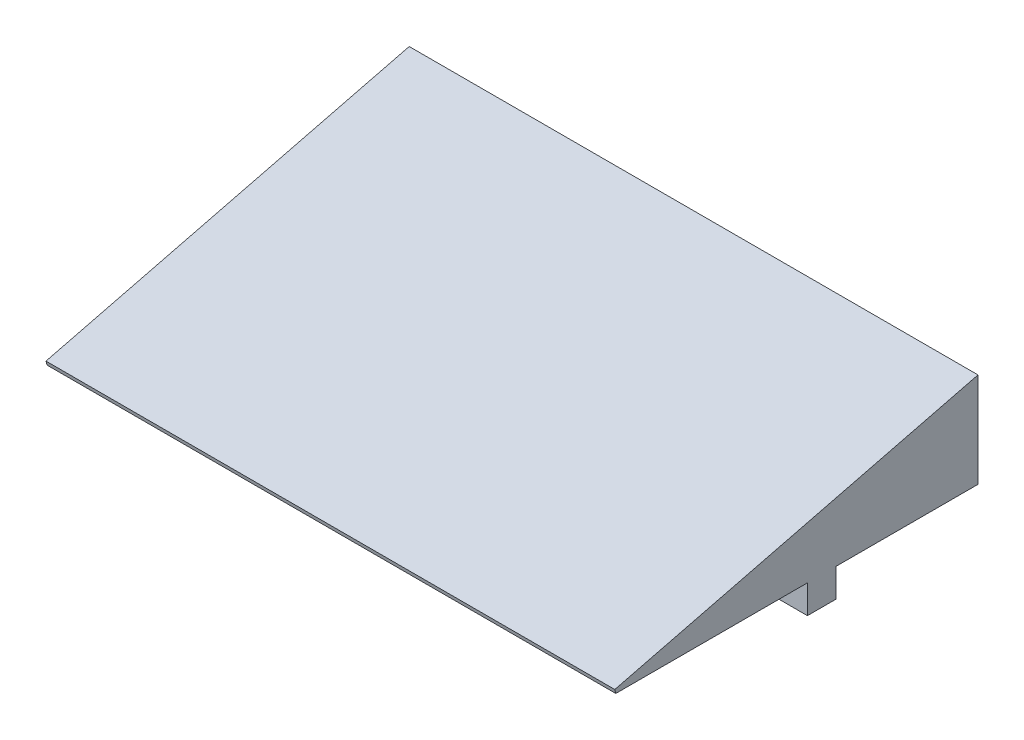
ISO-10303-21;
HEADER;
FILE_DESCRIPTION(('STEP AP214'),'2;1');
FILE_NAME('part.step','',(''),(''),'','','');
FILE_SCHEMA(('AUTOMOTIVE_DESIGN { 1 0 10303 214 1 1 1 1 }'));
ENDSEC;
DATA;
#1=APPLICATION_CONTEXT('core data for automotive mechanical design processes');
#2=APPLICATION_PROTOCOL_DEFINITION('international standard','automotive_design',2000,#1);
#3=PRODUCT_CONTEXT('',#1,'mechanical');
#4=PRODUCT('Part','Part','',(#3));
#5=PRODUCT_RELATED_PRODUCT_CATEGORY('part','',(#4));
#6=PRODUCT_DEFINITION_FORMATION('','',#4);
#7=PRODUCT_DEFINITION_CONTEXT('part definition',#1,'design');
#8=PRODUCT_DEFINITION('design','',#6,#7);
#9=PRODUCT_DEFINITION_SHAPE('','',#8);
#10=(LENGTH_UNIT() NAMED_UNIT(*) SI_UNIT(.MILLI.,.METRE.));
#11=(NAMED_UNIT(*) PLANE_ANGLE_UNIT() SI_UNIT($,.RADIAN.));
#12=(NAMED_UNIT(*) SI_UNIT($,.STERADIAN.) SOLID_ANGLE_UNIT());
#13=UNCERTAINTY_MEASURE_WITH_UNIT(LENGTH_MEASURE(1.E-05),#10,'distance_accuracy_value','');
#14=(GEOMETRIC_REPRESENTATION_CONTEXT(3) GLOBAL_UNCERTAINTY_ASSIGNED_CONTEXT((#13)) GLOBAL_UNIT_ASSIGNED_CONTEXT((#10,
#11,#12)) REPRESENTATION_CONTEXT('',''));
#15=CARTESIAN_POINT('',(0.,0.,0.));
#16=DIRECTION('',(0.,0.,1.));
#17=DIRECTION('',(1.,0.,0.));
#18=AXIS2_PLACEMENT_3D('',#15,#16,#17);
#19=CARTESIAN_POINT('',(0.,0.,0.));
#20=DIRECTION('',(0.,1.,0.));
#21=DIRECTION('',(0.,0.,1.));
#22=AXIS2_PLACEMENT_3D('',#19,#20,#21);
#23=PLANE('',#22);
#24=DIRECTION('',(1.,0.,0.));
#25=VECTOR('',#24,1.);
#26=CARTESIAN_POINT('',(-60.,0.,-10.0143227529929));
#27=LINE('',#26,#25);
#28=CARTESIAN_POINT('',(-60.,0.,-10.0143227529929));
#29=VERTEX_POINT('',#28);
#30=CARTESIAN_POINT('',(60.,0.,-10.0143227529929));
#31=VERTEX_POINT('',#30);
#32=EDGE_CURVE('E146',#29,#31,#27,.T.);
#33=ORIENTED_EDGE('',*,*,#32,.F.);
#34=DIRECTION('',(0.,0.,1.));
#35=VECTOR('',#34,1.);
#36=CARTESIAN_POINT('',(-60.,0.,-40.));
#37=LINE('',#36,#35);
#38=CARTESIAN_POINT('',(-60.,0.,-40.));
#39=VERTEX_POINT('',#38);
#40=EDGE_CURVE('E135',#39,#29,#37,.T.);
#41=ORIENTED_EDGE('',*,*,#40,.F.);
#42=DIRECTION('',(-1.,0.,0.));
#43=VECTOR('',#42,1.);
#44=CARTESIAN_POINT('',(-60.,0.,-40.));
#45=LINE('',#44,#43);
#46=CARTESIAN_POINT('',(60.,0.,-40.));
#47=VERTEX_POINT('',#46);
#48=EDGE_CURVE('E133',#47,#39,#45,.T.);
#49=ORIENTED_EDGE('',*,*,#48,.F.);
#50=DIRECTION('',(0.,0.,-1.));
#51=VECTOR('',#50,1.);
#52=CARTESIAN_POINT('',(60.,0.,-40.));
#53=LINE('',#52,#51);
#54=EDGE_CURVE('E125',#31,#47,#53,.T.);
#55=ORIENTED_EDGE('',*,*,#54,.F.);
#56=EDGE_LOOP('',(#33,#41,#49,#55));
#57=FACE_BOUND('',#56,.T.);
#58=ADVANCED_FACE('F35',(#57),#23,.F.);
#59=CARTESIAN_POINT('',(60.,20.,-40.));
#60=DIRECTION('',(-1.,0.,0.));
#61=DIRECTION('',(0.,0.,1.));
#62=AXIS2_PLACEMENT_3D('',#59,#60,#61);
#63=PLANE('',#62);
#64=DIRECTION('',(0.,-0.24261738767885,0.970122055823849));
#65=VECTOR('',#64,1.);
#66=CARTESIAN_POINT('',(60.,9.40799690737311,2.35284170610797));
#67=LINE('',#66,#65);
#68=CARTESIAN_POINT('',(60.,0.836645972513454,36.625968911321));
#69=VERTEX_POINT('',#68);
#70=CARTESIAN_POINT('',(60.,20.,-40.));
#71=VERTEX_POINT('',#70);
#72=EDGE_CURVE('E39',#69,#71,#67,.F.);
#73=ORIENTED_EDGE('',*,*,#72,.F.);
#74=DIRECTION('',(0.,0.970122055823849,0.24261738767885));
#75=VECTOR('',#74,1.);
#76=CARTESIAN_POINT('',(60.,-8.86457458572503,34.1997950345325));
#77=LINE('',#76,#75);
#78=CARTESIAN_POINT('',(60.,0.,36.4167324971557));
#79=VERTEX_POINT('',#78);
#80=EDGE_CURVE('E51',#79,#69,#77,.T.);
#81=ORIENTED_EDGE('',*,*,#80,.F.);
#82=CARTESIAN_POINT('',(60.,0.,-4.01432275299291));
#83=VERTEX_POINT('',#82);
#84=EDGE_CURVE('E58',#79,#83,#53,.T.);
#85=ORIENTED_EDGE('',*,*,#84,.T.);
#86=DIRECTION('',(0.,-1.,0.));
#87=VECTOR('',#86,1.);
#88=CARTESIAN_POINT('',(60.,0.,-4.01432275299292));
#89=LINE('',#88,#87);
#90=CARTESIAN_POINT('',(60.,-6.,-4.01432275299293));
#91=VERTEX_POINT('',#90);
#92=EDGE_CURVE('E154',#83,#91,#89,.T.);
#93=ORIENTED_EDGE('',*,*,#92,.T.);
#94=DIRECTION('',(0.,0.,-1.));
#95=VECTOR('',#94,1.);
#96=CARTESIAN_POINT('',(60.,-6.,0.));
#97=LINE('',#96,#95);
#98=CARTESIAN_POINT('',(60.,-6.,-10.0143227529929));
#99=VERTEX_POINT('',#98);
#100=EDGE_CURVE('E159',#91,#99,#97,.T.);
#101=ORIENTED_EDGE('',*,*,#100,.T.);
#102=DIRECTION('',(0.,1.,0.));
#103=VECTOR('',#102,1.);
#104=CARTESIAN_POINT('',(60.,0.,-10.0143227529929));
#105=LINE('',#104,#103);
#106=EDGE_CURVE('E157',#99,#31,#105,.T.);
#107=ORIENTED_EDGE('',*,*,#106,.T.);
#108=ORIENTED_EDGE('',*,*,#54,.T.);
#109=DIRECTION('',(0.,-1.,0.));
#110=VECTOR('',#109,1.);
#111=CARTESIAN_POINT('',(60.,20.,-40.));
#112=LINE('',#111,#110);
#113=EDGE_CURVE('E11',#71,#47,#112,.T.);
#114=ORIENTED_EDGE('',*,*,#113,.F.);
#115=EDGE_LOOP('',(#73,#81,#85,#93,#101,#107,#108,#114));
#116=FACE_BOUND('',#115,.T.);
#117=ADVANCED_FACE('F37',(#116),#63,.F.);
#118=CARTESIAN_POINT('',(-60.,20.,-40.));
#119=DIRECTION('',(1.,0.,0.));
#120=DIRECTION('',(0.,0.,-1.));
#121=AXIS2_PLACEMENT_3D('',#118,#119,#120);
#122=PLANE('',#121);
#123=CARTESIAN_POINT('',(-60.,0.,-4.01432275299289));
#124=VERTEX_POINT('',#123);
#125=CARTESIAN_POINT('',(-60.,0.,36.4167324971557));
#126=VERTEX_POINT('',#125);
#127=EDGE_CURVE('E116',#124,#126,#37,.T.);
#128=ORIENTED_EDGE('',*,*,#127,.T.);
#129=DIRECTION('',(0.,0.970122055823849,0.24261738767885));
#130=VECTOR('',#129,1.);
#131=CARTESIAN_POINT('',(-60.,-8.86457458572502,34.1997950345325));
#132=LINE('',#131,#130);
#133=CARTESIAN_POINT('',(-60.,0.836645972513463,36.625968911321));
#134=VERTEX_POINT('',#133);
#135=EDGE_CURVE('E102',#126,#134,#132,.T.);
#136=ORIENTED_EDGE('',*,*,#135,.T.);
#137=DIRECTION('',(0.,0.24261738767885,-0.970122055823849));
#138=VECTOR('',#137,1.);
#139=CARTESIAN_POINT('',(-60.,9.40799690737311,2.352841706108));
#140=LINE('',#139,#138);
#141=CARTESIAN_POINT('',(-60.,20.,-40.));
#142=VERTEX_POINT('',#141);
#143=EDGE_CURVE('E112',#134,#142,#140,.T.);
#144=ORIENTED_EDGE('',*,*,#143,.T.);
#145=DIRECTION('',(0.,-1.,0.));
#146=VECTOR('',#145,1.);
#147=CARTESIAN_POINT('',(-60.,20.,-40.));
#148=LINE('',#147,#146);
#149=EDGE_CURVE('E44',#142,#39,#148,.T.);
#150=ORIENTED_EDGE('',*,*,#149,.T.);
#151=ORIENTED_EDGE('',*,*,#40,.T.);
#152=DIRECTION('',(0.,1.,0.));
#153=VECTOR('',#152,1.);
#154=CARTESIAN_POINT('',(-60.,0.,-10.0143227529929));
#155=LINE('',#154,#153);
#156=CARTESIAN_POINT('',(-60.,-6.,-10.0143227529929));
#157=VERTEX_POINT('',#156);
#158=EDGE_CURVE('E164',#157,#29,#155,.T.);
#159=ORIENTED_EDGE('',*,*,#158,.F.);
#160=DIRECTION('',(0.,0.,-1.));
#161=VECTOR('',#160,1.);
#162=CARTESIAN_POINT('',(-60.,-6.,0.));
#163=LINE('',#162,#161);
#164=CARTESIAN_POINT('',(-60.,-6.,-4.01432275299289));
#165=VERTEX_POINT('',#164);
#166=EDGE_CURVE('E156',#165,#157,#163,.T.);
#167=ORIENTED_EDGE('',*,*,#166,.F.);
#168=DIRECTION('',(0.,-1.,0.));
#169=VECTOR('',#168,1.);
#170=CARTESIAN_POINT('',(-60.,0.,-4.01432275299289));
#171=LINE('',#170,#169);
#172=EDGE_CURVE('E152',#124,#165,#171,.T.);
#173=ORIENTED_EDGE('',*,*,#172,.F.);
#174=EDGE_LOOP('',(#128,#136,#144,#150,#151,#159,#167,#173));
#175=FACE_BOUND('',#174,.T.);
#176=ADVANCED_FACE('F110',(#175),#122,.F.);
#177=ORIENTED_EDGE('',*,*,#84,.F.);
#178=DIRECTION('',(-1.,0.,0.));
#179=VECTOR('',#178,1.);
#180=CARTESIAN_POINT('',(0.,0.,36.4167324971557));
#181=LINE('',#180,#179);
#182=EDGE_CURVE('E117',#79,#126,#181,.T.);
#183=ORIENTED_EDGE('',*,*,#182,.T.);
#184=ORIENTED_EDGE('',*,*,#127,.F.);
#185=DIRECTION('',(1.,0.,0.));
#186=VECTOR('',#185,1.);
#187=CARTESIAN_POINT('',(-60.,0.,-4.01432275299289));
#188=LINE('',#187,#186);
#189=EDGE_CURVE('E126',#124,#83,#188,.T.);
#190=ORIENTED_EDGE('',*,*,#189,.T.);
#191=EDGE_LOOP('',(#177,#183,#184,#190));
#192=FACE_BOUND('',#191,.T.);
#193=ADVANCED_FACE('F170',(#192),#23,.F.);
#194=CARTESIAN_POINT('',(-60.,20.,-40.));
#195=DIRECTION('',(0.,0.,1.));
#196=DIRECTION('',(1.,0.,0.));
#197=AXIS2_PLACEMENT_3D('',#194,#195,#196);
#198=PLANE('',#197);
#199=ORIENTED_EDGE('',*,*,#48,.T.);
#200=ORIENTED_EDGE('',*,*,#149,.F.);
#201=DIRECTION('',(-1.,0.,0.));
#202=VECTOR('',#201,1.);
#203=CARTESIAN_POINT('',(-60.,20.,-40.));
#204=LINE('',#203,#202);
#205=EDGE_CURVE('E121',#71,#142,#204,.T.);
#206=ORIENTED_EDGE('',*,*,#205,.F.);
#207=ORIENTED_EDGE('',*,*,#113,.T.);
#208=EDGE_LOOP('',(#199,#200,#206,#207));
#209=FACE_BOUND('',#208,.T.);
#210=ADVANCED_FACE('F172',(#209),#198,.F.);
#211=CARTESIAN_POINT('',(60.000012,9.40799690737311,2.35284170610797));
#212=DIRECTION('',(0.,0.970122055823849,0.24261738767885));
#213=DIRECTION('',(0.,-0.24261738767885,0.970122055823849));
#214=AXIS2_PLACEMENT_3D('',#211,#212,#213);
#215=PLANE('',#214);
#216=DIRECTION('',(-1.,0.,0.));
#217=VECTOR('',#216,1.);
#218=CARTESIAN_POINT('',(-60.,0.836645972513463,36.625968911321));
#219=LINE('',#218,#217);
#220=EDGE_CURVE('E99',#69,#134,#219,.T.);
#221=ORIENTED_EDGE('',*,*,#220,.F.);
#222=ORIENTED_EDGE('',*,*,#72,.T.);
#223=ORIENTED_EDGE('',*,*,#205,.T.);
#224=ORIENTED_EDGE('',*,*,#143,.F.);
#225=EDGE_LOOP('',(#221,#222,#223,#224));
#226=FACE_BOUND('',#225,.T.);
#227=ADVANCED_FACE('F119',(#226),#215,.T.);
#228=CARTESIAN_POINT('',(-60.,-6.,0.));
#229=DIRECTION('',(0.,-1.,0.));
#230=DIRECTION('',(0.,0.,-1.));
#231=AXIS2_PLACEMENT_3D('',#228,#229,#230);
#232=PLANE('',#231);
#233=ORIENTED_EDGE('',*,*,#100,.F.);
#234=DIRECTION('',(1.,0.,0.));
#235=VECTOR('',#234,1.);
#236=CARTESIAN_POINT('',(-60.,-6.,-4.01432275299289));
#237=LINE('',#236,#235);
#238=EDGE_CURVE('E123',#165,#91,#237,.T.);
#239=ORIENTED_EDGE('',*,*,#238,.F.);
#240=ORIENTED_EDGE('',*,*,#166,.T.);
#241=DIRECTION('',(1.,0.,0.));
#242=VECTOR('',#241,1.);
#243=CARTESIAN_POINT('',(-60.,-6.,-10.0143227529929));
#244=LINE('',#243,#242);
#245=EDGE_CURVE('E130',#157,#99,#244,.T.);
#246=ORIENTED_EDGE('',*,*,#245,.T.);
#247=EDGE_LOOP('',(#233,#239,#240,#246));
#248=FACE_BOUND('',#247,.T.);
#249=ADVANCED_FACE('F179',(#248),#232,.T.);
#250=CARTESIAN_POINT('',(-60.,0.,-4.01432275299289));
#251=DIRECTION('',(0.,0.,1.));
#252=DIRECTION('',(1.,0.,0.));
#253=AXIS2_PLACEMENT_3D('',#250,#251,#252);
#254=PLANE('',#253);
#255=ORIENTED_EDGE('',*,*,#92,.F.);
#256=ORIENTED_EDGE('',*,*,#189,.F.);
#257=ORIENTED_EDGE('',*,*,#172,.T.);
#258=ORIENTED_EDGE('',*,*,#238,.T.);
#259=EDGE_LOOP('',(#255,#256,#257,#258));
#260=FACE_BOUND('',#259,.T.);
#261=ADVANCED_FACE('F200',(#260),#254,.T.);
#262=CARTESIAN_POINT('',(-60.,0.,-10.0143227529929));
#263=DIRECTION('',(0.,0.,-1.));
#264=DIRECTION('',(-1.,0.,0.));
#265=AXIS2_PLACEMENT_3D('',#262,#263,#264);
#266=PLANE('',#265);
#267=ORIENTED_EDGE('',*,*,#106,.F.);
#268=ORIENTED_EDGE('',*,*,#245,.F.);
#269=ORIENTED_EDGE('',*,*,#158,.T.);
#270=ORIENTED_EDGE('',*,*,#32,.T.);
#271=EDGE_LOOP('',(#267,#268,#269,#270));
#272=FACE_BOUND('',#271,.T.);
#273=ADVANCED_FACE('F207',(#272),#266,.T.);
#274=CARTESIAN_POINT('',(-60.,-8.86457458572502,34.1997950345325));
#275=DIRECTION('',(0.,0.24261738767885,-0.970122055823849));
#276=DIRECTION('',(0.,0.970122055823849,0.24261738767885));
#277=AXIS2_PLACEMENT_3D('',#274,#275,#276);
#278=PLANE('',#277);
#279=ORIENTED_EDGE('',*,*,#80,.T.);
#280=ORIENTED_EDGE('',*,*,#220,.T.);
#281=ORIENTED_EDGE('',*,*,#135,.F.);
#282=ORIENTED_EDGE('',*,*,#182,.F.);
#283=EDGE_LOOP('',(#279,#280,#281,#282));
#284=FACE_BOUND('',#283,.T.);
#285=ADVANCED_FACE('F101',(#284),#278,.F.);
#286=CLOSED_SHELL('',(#58,#117,#176,#193,#210,#227,#249,#261,#273,#285));
#287=MANIFOLD_SOLID_BREP('B2',#286);
#288=ADVANCED_BREP_SHAPE_REPRESENTATION('',(#18,#287),#14);
#289=SHAPE_DEFINITION_REPRESENTATION(#9,#288);
ENDSEC;
END-ISO-10303-21;
